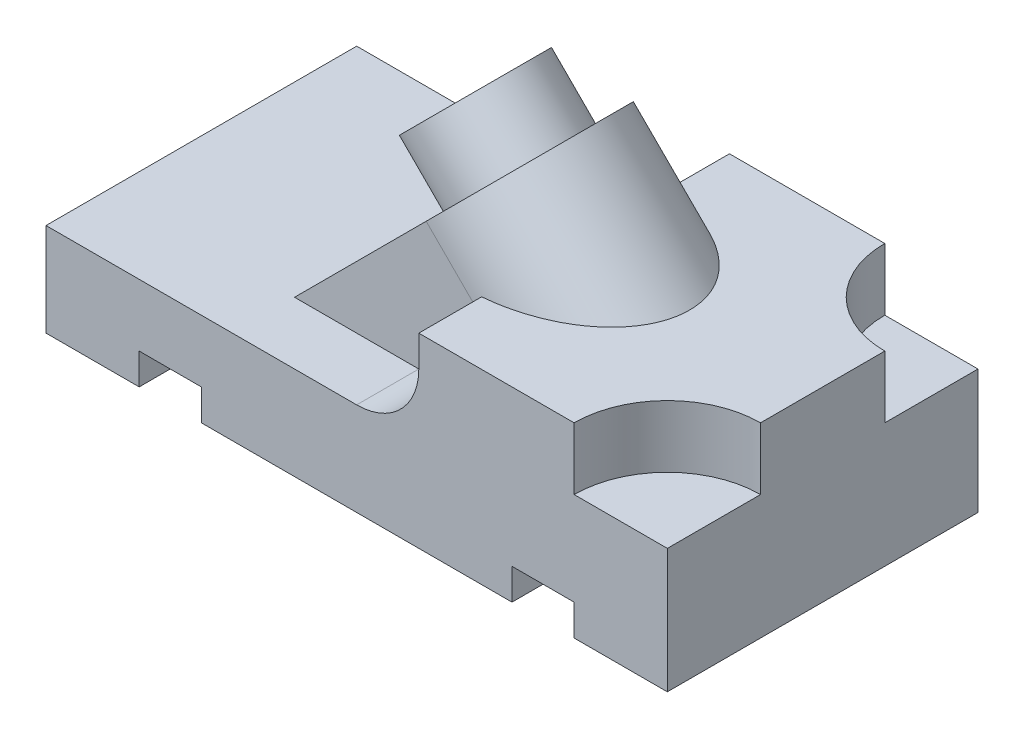
ISO-10303-21;
HEADER;
FILE_DESCRIPTION(('STEP AP214'),'2;1');
FILE_NAME('part.step','',(''),(''),'','','');
FILE_SCHEMA(('AUTOMOTIVE_DESIGN { 1 0 10303 214 1 1 1 1 }'));
ENDSEC;
DATA;
#1=APPLICATION_CONTEXT('core data for automotive mechanical design processes');
#2=APPLICATION_PROTOCOL_DEFINITION('international standard','automotive_design',2000,#1);
#3=PRODUCT_CONTEXT('',#1,'mechanical');
#4=PRODUCT('Part','Part','',(#3));
#5=PRODUCT_RELATED_PRODUCT_CATEGORY('part','',(#4));
#6=PRODUCT_DEFINITION_FORMATION('','',#4);
#7=PRODUCT_DEFINITION_CONTEXT('part definition',#1,'design');
#8=PRODUCT_DEFINITION('design','',#6,#7);
#9=PRODUCT_DEFINITION_SHAPE('','',#8);
#10=(LENGTH_UNIT() NAMED_UNIT(*) SI_UNIT(.MILLI.,.METRE.));
#11=(NAMED_UNIT(*) PLANE_ANGLE_UNIT() SI_UNIT($,.RADIAN.));
#12=(NAMED_UNIT(*) SI_UNIT($,.STERADIAN.) SOLID_ANGLE_UNIT());
#13=UNCERTAINTY_MEASURE_WITH_UNIT(LENGTH_MEASURE(1.E-05),#10,'distance_accuracy_value','');
#14=(GEOMETRIC_REPRESENTATION_CONTEXT(3) GLOBAL_UNCERTAINTY_ASSIGNED_CONTEXT((#13)) GLOBAL_UNIT_ASSIGNED_CONTEXT((#10,
#11,#12)) REPRESENTATION_CONTEXT('',''));
#15=CARTESIAN_POINT('',(0.,0.,0.));
#16=DIRECTION('',(0.,0.,1.));
#17=DIRECTION('',(1.,0.,0.));
#18=AXIS2_PLACEMENT_3D('',#15,#16,#17);
#19=CARTESIAN_POINT('',(100.,0.,50.));
#20=DIRECTION('',(0.,1.,0.));
#21=DIRECTION('',(0.,0.,1.));
#22=AXIS2_PLACEMENT_3D('',#19,#20,#21);
#23=PLANE('',#22);
#24=DIRECTION('',(0.,0.,1.));
#25=VECTOR('',#24,1.);
#26=CARTESIAN_POINT('',(25.,0.,0.));
#27=LINE('',#26,#25);
#28=CARTESIAN_POINT('',(25.,0.,0.));
#29=VERTEX_POINT('',#28);
#30=CARTESIAN_POINT('',(25.,0.,50.));
#31=VERTEX_POINT('',#30);
#32=EDGE_CURVE('E246',#29,#31,#27,.T.);
#33=ORIENTED_EDGE('',*,*,#32,.F.);
#34=DIRECTION('',(1.,0.,0.));
#35=VECTOR('',#34,1.);
#36=CARTESIAN_POINT('',(100.,0.,0.));
#37=LINE('',#36,#35);
#38=CARTESIAN_POINT('',(75.,0.,0.));
#39=VERTEX_POINT('',#38);
#40=EDGE_CURVE('E230',#29,#39,#37,.T.);
#41=ORIENTED_EDGE('',*,*,#40,.T.);
#42=DIRECTION('',(0.,0.,1.));
#43=VECTOR('',#42,1.);
#44=CARTESIAN_POINT('',(75.,0.,0.));
#45=LINE('',#44,#43);
#46=CARTESIAN_POINT('',(75.,0.,50.));
#47=VERTEX_POINT('',#46);
#48=EDGE_CURVE('E280',#39,#47,#45,.T.);
#49=ORIENTED_EDGE('',*,*,#48,.T.);
#50=DIRECTION('',(1.,0.,0.));
#51=VECTOR('',#50,1.);
#52=CARTESIAN_POINT('',(100.,0.,50.));
#53=LINE('',#52,#51);
#54=EDGE_CURVE('E383',#31,#47,#53,.T.);
#55=ORIENTED_EDGE('',*,*,#54,.F.);
#56=EDGE_LOOP('',(#33,#41,#49,#55));
#57=FACE_BOUND('',#56,.T.);
#58=ADVANCED_FACE('F41',(#57),#23,.F.);
#59=DIRECTION('',(0.,0.,1.));
#60=VECTOR('',#59,1.);
#61=CARTESIAN_POINT('',(15.,0.,0.));
#62=LINE('',#61,#60);
#63=CARTESIAN_POINT('',(15.,0.,0.));
#64=VERTEX_POINT('',#63);
#65=CARTESIAN_POINT('',(15.,0.,50.));
#66=VERTEX_POINT('',#65);
#67=EDGE_CURVE('E250',#64,#66,#62,.T.);
#68=ORIENTED_EDGE('',*,*,#67,.T.);
#69=CARTESIAN_POINT('',(0.,0.,50.));
#70=VERTEX_POINT('',#69);
#71=EDGE_CURVE('E378',#70,#66,#53,.T.);
#72=ORIENTED_EDGE('',*,*,#71,.F.);
#73=DIRECTION('',(0.,0.,-1.));
#74=VECTOR('',#73,1.);
#75=CARTESIAN_POINT('',(0.,0.,50.));
#76=LINE('',#75,#74);
#77=CARTESIAN_POINT('',(0.,0.,0.));
#78=VERTEX_POINT('',#77);
#79=EDGE_CURVE('E403',#70,#78,#76,.T.);
#80=ORIENTED_EDGE('',*,*,#79,.T.);
#81=EDGE_CURVE('E404',#78,#64,#37,.T.);
#82=ORIENTED_EDGE('',*,*,#81,.T.);
#83=EDGE_LOOP('',(#68,#72,#80,#82));
#84=FACE_BOUND('',#83,.T.);
#85=ADVANCED_FACE('F516',(#84),#23,.F.);
#86=DIRECTION('',(0.,0.,1.));
#87=VECTOR('',#86,1.);
#88=CARTESIAN_POINT('',(85.,0.,0.));
#89=LINE('',#88,#87);
#90=CARTESIAN_POINT('',(85.,0.,0.));
#91=VERTEX_POINT('',#90);
#92=CARTESIAN_POINT('',(85.,0.,50.));
#93=VERTEX_POINT('',#92);
#94=EDGE_CURVE('E243',#91,#93,#89,.T.);
#95=ORIENTED_EDGE('',*,*,#94,.F.);
#96=CARTESIAN_POINT('',(100.,0.,0.));
#97=VERTEX_POINT('',#96);
#98=EDGE_CURVE('E345',#91,#97,#37,.T.);
#99=ORIENTED_EDGE('',*,*,#98,.T.);
#100=DIRECTION('',(0.,0.,-1.));
#101=VECTOR('',#100,1.);
#102=CARTESIAN_POINT('',(100.,0.,50.));
#103=LINE('',#102,#101);
#104=CARTESIAN_POINT('',(100.,0.,50.));
#105=VERTEX_POINT('',#104);
#106=EDGE_CURVE('E455',#105,#97,#103,.T.);
#107=ORIENTED_EDGE('',*,*,#106,.F.);
#108=EDGE_CURVE('E384',#93,#105,#53,.T.);
#109=ORIENTED_EDGE('',*,*,#108,.F.);
#110=EDGE_LOOP('',(#95,#99,#107,#109));
#111=FACE_BOUND('',#110,.T.);
#112=ADVANCED_FACE('F547',(#111),#23,.F.);
#113=CARTESIAN_POINT('',(50.,25.,50.));
#114=DIRECTION('',(0.,0.,1.));
#115=DIRECTION('',(1.,0.,0.));
#116=AXIS2_PLACEMENT_3D('',#113,#114,#115);
#117=PLANE('',#116);
#118=DIRECTION('',(1.,0.,0.));
#119=VECTOR('',#118,1.);
#120=CARTESIAN_POINT('',(0.,5.,50.));
#121=LINE('',#120,#119);
#122=CARTESIAN_POINT('',(15.,5.,50.));
#123=VERTEX_POINT('',#122);
#124=CARTESIAN_POINT('',(25.,5.,50.));
#125=VERTEX_POINT('',#124);
#126=EDGE_CURVE('E236',#123,#125,#121,.T.);
#127=ORIENTED_EDGE('',*,*,#126,.T.);
#128=DIRECTION('',(0.,-1.,0.));
#129=VECTOR('',#128,1.);
#130=CARTESIAN_POINT('',(25.,0.,50.));
#131=LINE('',#130,#129);
#132=EDGE_CURVE('E222',#125,#31,#131,.T.);
#133=ORIENTED_EDGE('',*,*,#132,.T.);
#134=ORIENTED_EDGE('',*,*,#54,.T.);
#135=DIRECTION('',(0.,1.,0.));
#136=VECTOR('',#135,1.);
#137=CARTESIAN_POINT('',(75.,0.,50.));
#138=LINE('',#137,#136);
#139=CARTESIAN_POINT('',(75.,5.,50.));
#140=VERTEX_POINT('',#139);
#141=EDGE_CURVE('E260',#47,#140,#138,.T.);
#142=ORIENTED_EDGE('',*,*,#141,.T.);
#143=DIRECTION('',(1.,0.,0.));
#144=VECTOR('',#143,1.);
#145=CARTESIAN_POINT('',(0.,5.,50.));
#146=LINE('',#145,#144);
#147=CARTESIAN_POINT('',(85.,5.,50.));
#148=VERTEX_POINT('',#147);
#149=EDGE_CURVE('E271',#140,#148,#146,.T.);
#150=ORIENTED_EDGE('',*,*,#149,.T.);
#151=DIRECTION('',(0.,-1.,0.));
#152=VECTOR('',#151,1.);
#153=CARTESIAN_POINT('',(85.,0.,50.));
#154=LINE('',#153,#152);
#155=EDGE_CURVE('E267',#148,#93,#154,.T.);
#156=ORIENTED_EDGE('',*,*,#155,.T.);
#157=ORIENTED_EDGE('',*,*,#108,.T.);
#158=DIRECTION('',(0.,1.,0.));
#159=VECTOR('',#158,1.);
#160=CARTESIAN_POINT('',(100.,30.,50.));
#161=LINE('',#160,#159);
#162=CARTESIAN_POINT('',(100.,20.,50.));
#163=VERTEX_POINT('',#162);
#164=EDGE_CURVE('E382',#105,#163,#161,.T.);
#165=ORIENTED_EDGE('',*,*,#164,.T.);
#166=DIRECTION('',(-1.,0.,0.));
#167=VECTOR('',#166,1.);
#168=CARTESIAN_POINT('',(50.,20.,50.));
#169=LINE('',#168,#167);
#170=CARTESIAN_POINT('',(85.,20.,50.));
#171=VERTEX_POINT('',#170);
#172=EDGE_CURVE('E49',#163,#171,#169,.T.);
#173=ORIENTED_EDGE('',*,*,#172,.T.);
#174=DIRECTION('',(0.,1.,0.));
#175=VECTOR('',#174,1.);
#176=CARTESIAN_POINT('',(85.,20.,50.));
#177=LINE('',#176,#175);
#178=CARTESIAN_POINT('',(85.,30.,50.));
#179=VERTEX_POINT('',#178);
#180=EDGE_CURVE('E11',#179,#171,#177,.F.);
#181=ORIENTED_EDGE('',*,*,#180,.F.);
#182=DIRECTION('',(-1.,0.,0.));
#183=VECTOR('',#182,1.);
#184=CARTESIAN_POINT('',(60.,30.,50.));
#185=LINE('',#184,#183);
#186=CARTESIAN_POINT('',(60.,30.,50.));
#187=VERTEX_POINT('',#186);
#188=EDGE_CURVE('E388',#179,#187,#185,.T.);
#189=ORIENTED_EDGE('',*,*,#188,.T.);
#190=DIRECTION('',(0.,-1.,0.));
#191=VECTOR('',#190,1.);
#192=CARTESIAN_POINT('',(60.,25.0000000000001,50.));
#193=LINE('',#192,#191);
#194=CARTESIAN_POINT('',(60.,25.,50.));
#195=VERTEX_POINT('',#194);
#196=EDGE_CURVE('E391',#187,#195,#193,.T.);
#197=ORIENTED_EDGE('',*,*,#196,.T.);
#198=CARTESIAN_POINT('',(50.,25.,50.));
#199=DIRECTION('',(0.,0.,-1.));
#200=DIRECTION('',(1.,0.,0.));
#201=AXIS2_PLACEMENT_3D('',#198,#199,#200);
#202=CIRCLE('',#201,10.);
#203=CARTESIAN_POINT('',(50.,15.,50.));
#204=VERTEX_POINT('',#203);
#205=EDGE_CURVE('E394',#195,#204,#202,.T.);
#206=ORIENTED_EDGE('',*,*,#205,.T.);
#207=DIRECTION('',(-1.,0.,0.));
#208=VECTOR('',#207,1.);
#209=CARTESIAN_POINT('',(0.,15.,50.));
#210=LINE('',#209,#208);
#211=CARTESIAN_POINT('',(0.,15.,50.));
#212=VERTEX_POINT('',#211);
#213=EDGE_CURVE('E397',#204,#212,#210,.T.);
#214=ORIENTED_EDGE('',*,*,#213,.T.);
#215=DIRECTION('',(0.,-1.,0.));
#216=VECTOR('',#215,1.);
#217=CARTESIAN_POINT('',(0.,0.,50.));
#218=LINE('',#217,#216);
#219=EDGE_CURVE('E400',#212,#70,#218,.T.);
#220=ORIENTED_EDGE('',*,*,#219,.T.);
#221=ORIENTED_EDGE('',*,*,#71,.T.);
#222=DIRECTION('',(0.,1.,0.));
#223=VECTOR('',#222,1.);
#224=CARTESIAN_POINT('',(15.,0.,50.));
#225=LINE('',#224,#223);
#226=EDGE_CURVE('E232',#66,#123,#225,.T.);
#227=ORIENTED_EDGE('',*,*,#226,.T.);
#228=EDGE_LOOP('',(#127,#133,#134,#142,#150,#156,#157,#165,#173,#181,#189,#197,#206,#214,#220,
#221,#227));
#229=FACE_BOUND('',#228,.T.);
#230=ADVANCED_FACE('F473',(#229),#117,.T.);
#231=CARTESIAN_POINT('',(50.,25.,0.));
#232=DIRECTION('',(0.,0.,1.));
#233=DIRECTION('',(1.,0.,0.));
#234=AXIS2_PLACEMENT_3D('',#231,#232,#233);
#235=PLANE('',#234);
#236=DIRECTION('',(0.,-1.,0.));
#237=VECTOR('',#236,1.);
#238=CARTESIAN_POINT('',(25.,0.,0.));
#239=LINE('',#238,#237);
#240=CARTESIAN_POINT('',(25.,5.,0.));
#241=VERTEX_POINT('',#240);
#242=EDGE_CURVE('E216',#241,#29,#239,.T.);
#243=ORIENTED_EDGE('',*,*,#242,.F.);
#244=DIRECTION('',(1.,0.,0.));
#245=VECTOR('',#244,1.);
#246=CARTESIAN_POINT('',(0.,5.,0.));
#247=LINE('',#246,#245);
#248=CARTESIAN_POINT('',(15.,5.,0.));
#249=VERTEX_POINT('',#248);
#250=EDGE_CURVE('E206',#249,#241,#247,.T.);
#251=ORIENTED_EDGE('',*,*,#250,.F.);
#252=DIRECTION('',(0.,1.,0.));
#253=VECTOR('',#252,1.);
#254=CARTESIAN_POINT('',(15.,0.,0.));
#255=LINE('',#254,#253);
#256=EDGE_CURVE('E215',#64,#249,#255,.T.);
#257=ORIENTED_EDGE('',*,*,#256,.F.);
#258=ORIENTED_EDGE('',*,*,#81,.F.);
#259=DIRECTION('',(0.,-1.,0.));
#260=VECTOR('',#259,1.);
#261=CARTESIAN_POINT('',(0.,0.,0.));
#262=LINE('',#261,#260);
#263=CARTESIAN_POINT('',(0.,15.,0.));
#264=VERTEX_POINT('',#263);
#265=EDGE_CURVE('E426',#264,#78,#262,.T.);
#266=ORIENTED_EDGE('',*,*,#265,.F.);
#267=DIRECTION('',(-1.,0.,0.));
#268=VECTOR('',#267,1.);
#269=CARTESIAN_POINT('',(0.,15.,0.));
#270=LINE('',#269,#268);
#271=CARTESIAN_POINT('',(50.,15.,0.));
#272=VERTEX_POINT('',#271);
#273=EDGE_CURVE('E423',#272,#264,#270,.T.);
#274=ORIENTED_EDGE('',*,*,#273,.F.);
#275=CARTESIAN_POINT('',(50.,25.,0.));
#276=DIRECTION('',(0.,0.,-1.));
#277=DIRECTION('',(1.,0.,0.));
#278=AXIS2_PLACEMENT_3D('',#275,#276,#277);
#279=CIRCLE('',#278,10.);
#280=CARTESIAN_POINT('',(60.,25.,0.));
#281=VERTEX_POINT('',#280);
#282=EDGE_CURVE('E419',#281,#272,#279,.T.);
#283=ORIENTED_EDGE('',*,*,#282,.F.);
#284=DIRECTION('',(0.,-1.,0.));
#285=VECTOR('',#284,1.);
#286=CARTESIAN_POINT('',(60.,25.0000000000001,0.));
#287=LINE('',#286,#285);
#288=CARTESIAN_POINT('',(60.,30.,0.));
#289=VERTEX_POINT('',#288);
#290=EDGE_CURVE('E415',#289,#281,#287,.T.);
#291=ORIENTED_EDGE('',*,*,#290,.F.);
#292=DIRECTION('',(-1.,0.,0.));
#293=VECTOR('',#292,1.);
#294=CARTESIAN_POINT('',(60.,30.,0.));
#295=LINE('',#294,#293);
#296=CARTESIAN_POINT('',(85.,30.,0.));
#297=VERTEX_POINT('',#296);
#298=EDGE_CURVE('E412',#297,#289,#295,.T.);
#299=ORIENTED_EDGE('',*,*,#298,.F.);
#300=DIRECTION('',(0.,1.,0.));
#301=VECTOR('',#300,1.);
#302=CARTESIAN_POINT('',(85.,20.,0.));
#303=LINE('',#302,#301);
#304=CARTESIAN_POINT('',(85.,20.,0.));
#305=VERTEX_POINT('',#304);
#306=EDGE_CURVE('E466',#297,#305,#303,.F.);
#307=ORIENTED_EDGE('',*,*,#306,.T.);
#308=DIRECTION('',(-1.,0.,0.));
#309=VECTOR('',#308,1.);
#310=CARTESIAN_POINT('',(50.,20.,0.));
#311=LINE('',#310,#309);
#312=CARTESIAN_POINT('',(100.,20.,0.));
#313=VERTEX_POINT('',#312);
#314=EDGE_CURVE('E463',#313,#305,#311,.T.);
#315=ORIENTED_EDGE('',*,*,#314,.F.);
#316=DIRECTION('',(0.,1.,0.));
#317=VECTOR('',#316,1.);
#318=CARTESIAN_POINT('',(100.,30.,0.));
#319=LINE('',#318,#317);
#320=EDGE_CURVE('E408',#97,#313,#319,.T.);
#321=ORIENTED_EDGE('',*,*,#320,.F.);
#322=ORIENTED_EDGE('',*,*,#98,.F.);
#323=DIRECTION('',(0.,-1.,0.));
#324=VECTOR('',#323,1.);
#325=CARTESIAN_POINT('',(85.,0.,0.));
#326=LINE('',#325,#324);
#327=CARTESIAN_POINT('',(85.,5.,0.));
#328=VERTEX_POINT('',#327);
#329=EDGE_CURVE('E256',#328,#91,#326,.T.);
#330=ORIENTED_EDGE('',*,*,#329,.F.);
#331=DIRECTION('',(1.,0.,0.));
#332=VECTOR('',#331,1.);
#333=CARTESIAN_POINT('',(0.,5.,0.));
#334=LINE('',#333,#332);
#335=CARTESIAN_POINT('',(75.,5.,0.));
#336=VERTEX_POINT('',#335);
#337=EDGE_CURVE('E259',#336,#328,#334,.T.);
#338=ORIENTED_EDGE('',*,*,#337,.F.);
#339=DIRECTION('',(0.,1.,0.));
#340=VECTOR('',#339,1.);
#341=CARTESIAN_POINT('',(75.,0.,0.));
#342=LINE('',#341,#340);
#343=EDGE_CURVE('E263',#39,#336,#342,.T.);
#344=ORIENTED_EDGE('',*,*,#343,.F.);
#345=ORIENTED_EDGE('',*,*,#40,.F.);
#346=EDGE_LOOP('',(#243,#251,#257,#258,#266,#274,#283,#291,#299,#307,#315,#321,#322,#330,#338,
#344,#345));
#347=FACE_BOUND('',#346,.T.);
#348=ADVANCED_FACE('F227',(#347),#235,.F.);
#349=CARTESIAN_POINT('',(60.,25.0000000000001,50.));
#350=DIRECTION('',(1.,0.,0.));
#351=DIRECTION('',(0.,0.,-1.));
#352=AXIS2_PLACEMENT_3D('',#349,#350,#351);
#353=PLANE('',#352);
#354=CARTESIAN_POINT('',(60.,27.3745695394363,25.));
#355=DIRECTION('',(1.,0.,0.));
#356=DIRECTION('',(0.,1.,0.));
#357=AXIS2_PLACEMENT_3D('',#354,#355,#356);
#358=ELLIPSE('',#357,21.2132034355964,15.);
#359=CARTESIAN_POINT('',(60.,30.,39.8846752550525));
#360=VERTEX_POINT('',#359);
#361=CARTESIAN_POINT('',(60.,27.3745695394363,40.));
#362=VERTEX_POINT('',#361);
#363=EDGE_CURVE('E337',#360,#362,#358,.T.);
#364=ORIENTED_EDGE('',*,*,#363,.T.);
#365=DIRECTION('',(0.,1.,0.));
#366=VECTOR('',#365,1.);
#367=CARTESIAN_POINT('',(60.,-50.0014142135624,40.));
#368=LINE('',#367,#366);
#369=CARTESIAN_POINT('',(60.,25.,40.));
#370=VERTEX_POINT('',#369);
#371=EDGE_CURVE('E330',#370,#362,#368,.T.);
#372=ORIENTED_EDGE('',*,*,#371,.F.);
#373=DIRECTION('',(0.,0.,-1.));
#374=VECTOR('',#373,1.);
#375=CARTESIAN_POINT('',(60.,25.,50.));
#376=LINE('',#375,#374);
#377=EDGE_CURVE('E442',#195,#370,#376,.T.);
#378=ORIENTED_EDGE('',*,*,#377,.F.);
#379=ORIENTED_EDGE('',*,*,#196,.F.);
#380=DIRECTION('',(0.,0.,-1.));
#381=VECTOR('',#380,1.);
#382=CARTESIAN_POINT('',(60.,30.,50.));
#383=LINE('',#382,#381);
#384=EDGE_CURVE('E447',#187,#360,#383,.T.);
#385=ORIENTED_EDGE('',*,*,#384,.T.);
#386=EDGE_LOOP('',(#364,#372,#378,#379,#385));
#387=FACE_BOUND('',#386,.T.);
#388=ADVANCED_FACE('F499',(#387),#353,.F.);
#389=CARTESIAN_POINT('',(60.,27.3745695394363,10.));
#390=VERTEX_POINT('',#389);
#391=CARTESIAN_POINT('',(60.,30.,10.1153247449475));
#392=VERTEX_POINT('',#391);
#393=EDGE_CURVE('E359',#390,#392,#358,.T.);
#394=ORIENTED_EDGE('',*,*,#393,.T.);
#395=EDGE_CURVE('E446',#392,#289,#383,.T.);
#396=ORIENTED_EDGE('',*,*,#395,.T.);
#397=ORIENTED_EDGE('',*,*,#290,.T.);
#398=CARTESIAN_POINT('',(60.,25.,10.));
#399=VERTEX_POINT('',#398);
#400=EDGE_CURVE('E441',#399,#281,#376,.T.);
#401=ORIENTED_EDGE('',*,*,#400,.F.);
#402=DIRECTION('',(0.,1.,0.));
#403=VECTOR('',#402,1.);
#404=CARTESIAN_POINT('',(60.,-50.0014142135624,10.));
#405=LINE('',#404,#403);
#406=EDGE_CURVE('E323',#399,#390,#405,.T.);
#407=ORIENTED_EDGE('',*,*,#406,.T.);
#408=EDGE_LOOP('',(#394,#396,#397,#401,#407));
#409=FACE_BOUND('',#408,.T.);
#410=ADVANCED_FACE('F532',(#409),#353,.F.);
#411=CARTESIAN_POINT('',(50.,25.,50.));
#412=DIRECTION('',(0.,0.,-1.));
#413=DIRECTION('',(-1.,0.,0.));
#414=AXIS2_PLACEMENT_3D('',#411,#412,#413);
#415=CYLINDRICAL_SURFACE('',#414,10.);
#416=CARTESIAN_POINT('',(50.,25.,10.));
#417=DIRECTION('',(0.,0.,1.));
#418=DIRECTION('',(1.,0.,0.));
#419=AXIS2_PLACEMENT_3D('',#416,#417,#418);
#420=CIRCLE('',#419,10.);
#421=CARTESIAN_POINT('',(50.,15.,10.));
#422=VERTEX_POINT('',#421);
#423=EDGE_CURVE('E371',#422,#399,#420,.T.);
#424=ORIENTED_EDGE('',*,*,#423,.T.);
#425=ORIENTED_EDGE('',*,*,#400,.T.);
#426=ORIENTED_EDGE('',*,*,#282,.T.);
#427=DIRECTION('',(0.,0.,-1.));
#428=VECTOR('',#427,1.);
#429=CARTESIAN_POINT('',(50.,15.,50.));
#430=LINE('',#429,#428);
#431=EDGE_CURVE('E436',#422,#272,#430,.T.);
#432=ORIENTED_EDGE('',*,*,#431,.F.);
#433=EDGE_LOOP('',(#424,#425,#426,#432));
#434=FACE_BOUND('',#433,.T.);
#435=ADVANCED_FACE('F527',(#434),#415,.F.);
#436=CARTESIAN_POINT('',(100.,30.,50.));
#437=DIRECTION('',(-1.,0.,0.));
#438=DIRECTION('',(0.,0.,1.));
#439=AXIS2_PLACEMENT_3D('',#436,#437,#438);
#440=PLANE('',#439);
#441=DIRECTION('',(0.,0.,-1.));
#442=VECTOR('',#441,1.);
#443=CARTESIAN_POINT('',(100.,20.,50.));
#444=LINE('',#443,#442);
#445=CARTESIAN_POINT('',(100.,20.,15.));
#446=VERTEX_POINT('',#445);
#447=EDGE_CURVE('E292',#446,#313,#444,.T.);
#448=ORIENTED_EDGE('',*,*,#447,.F.);
#449=DIRECTION('',(0.,1.,0.));
#450=VECTOR('',#449,1.);
#451=CARTESIAN_POINT('',(100.,20.,15.));
#452=LINE('',#451,#450);
#453=CARTESIAN_POINT('',(100.,30.,15.));
#454=VERTEX_POINT('',#453);
#455=EDGE_CURVE('E303',#446,#454,#452,.T.);
#456=ORIENTED_EDGE('',*,*,#455,.T.);
#457=DIRECTION('',(0.,0.,-1.));
#458=VECTOR('',#457,1.);
#459=CARTESIAN_POINT('',(100.,30.,50.));
#460=LINE('',#459,#458);
#461=CARTESIAN_POINT('',(100.,30.,35.));
#462=VERTEX_POINT('',#461);
#463=EDGE_CURVE('E451',#462,#454,#460,.T.);
#464=ORIENTED_EDGE('',*,*,#463,.F.);
#465=DIRECTION('',(0.,1.,0.));
#466=VECTOR('',#465,1.);
#467=CARTESIAN_POINT('',(100.,20.,35.));
#468=LINE('',#467,#466);
#469=CARTESIAN_POINT('',(100.,20.,35.));
#470=VERTEX_POINT('',#469);
#471=EDGE_CURVE('E310',#462,#470,#468,.F.);
#472=ORIENTED_EDGE('',*,*,#471,.T.);
#473=DIRECTION('',(0.,0.,-1.));
#474=VECTOR('',#473,1.);
#475=CARTESIAN_POINT('',(100.,20.,50.));
#476=LINE('',#475,#474);
#477=EDGE_CURVE('E307',#163,#470,#476,.T.);
#478=ORIENTED_EDGE('',*,*,#477,.F.);
#479=ORIENTED_EDGE('',*,*,#164,.F.);
#480=ORIENTED_EDGE('',*,*,#106,.T.);
#481=ORIENTED_EDGE('',*,*,#320,.T.);
#482=EDGE_LOOP('',(#448,#456,#464,#472,#478,#479,#480,#481));
#483=FACE_BOUND('',#482,.T.);
#484=ADVANCED_FACE('F482',(#483),#440,.F.);
#485=CARTESIAN_POINT('',(60.,30.,50.));
#486=DIRECTION('',(0.,-1.,0.));
#487=DIRECTION('',(0.,0.,-1.));
#488=AXIS2_PLACEMENT_3D('',#485,#486,#487);
#489=PLANE('',#488);
#490=ORIENTED_EDGE('',*,*,#463,.T.);
#491=CARTESIAN_POINT('',(100.,30.,0.));
#492=DIRECTION('',(0.,1.,0.));
#493=DIRECTION('',(0.,0.,1.));
#494=AXIS2_PLACEMENT_3D('',#491,#492,#493);
#495=CIRCLE('',#494,15.);
#496=EDGE_CURVE('E293',#297,#454,#495,.T.);
#497=ORIENTED_EDGE('',*,*,#496,.F.);
#498=ORIENTED_EDGE('',*,*,#298,.T.);
#499=ORIENTED_EDGE('',*,*,#395,.F.);
#500=CARTESIAN_POINT('',(57.3745695394363,30.,25.));
#501=DIRECTION('',(0.,-1.,0.));
#502=DIRECTION('',(-1.,0.,0.));
#503=AXIS2_PLACEMENT_3D('',#500,#501,#502);
#504=ELLIPSE('',#503,21.2132034355965,15.);
#505=EDGE_CURVE('E363',#392,#360,#504,.T.);
#506=ORIENTED_EDGE('',*,*,#505,.T.);
#507=ORIENTED_EDGE('',*,*,#384,.F.);
#508=ORIENTED_EDGE('',*,*,#188,.F.);
#509=CARTESIAN_POINT('',(100.,30.,50.));
#510=DIRECTION('',(0.,1.,0.));
#511=DIRECTION('',(0.,0.,1.));
#512=AXIS2_PLACEMENT_3D('',#509,#510,#511);
#513=CIRCLE('',#512,15.);
#514=EDGE_CURVE('E249',#462,#179,#513,.T.);
#515=ORIENTED_EDGE('',*,*,#514,.F.);
#516=EDGE_LOOP('',(#490,#497,#498,#499,#506,#507,#508,#515));
#517=FACE_BOUND('',#516,.T.);
#518=ADVANCED_FACE('F489',(#517),#489,.F.);
#519=ORIENTED_EDGE('',*,*,#377,.T.);
#520=CARTESIAN_POINT('',(50.,25.,40.));
#521=DIRECTION('',(0.,0.,1.));
#522=DIRECTION('',(0.,-1.,0.));
#523=AXIS2_PLACEMENT_3D('',#520,#521,#522);
#524=CIRCLE('',#523,10.);
#525=CARTESIAN_POINT('',(50.,15.,40.));
#526=VERTEX_POINT('',#525);
#527=EDGE_CURVE('E327',#526,#370,#524,.T.);
#528=ORIENTED_EDGE('',*,*,#527,.F.);
#529=EDGE_CURVE('E437',#204,#526,#430,.T.);
#530=ORIENTED_EDGE('',*,*,#529,.F.);
#531=ORIENTED_EDGE('',*,*,#205,.F.);
#532=EDGE_LOOP('',(#519,#528,#530,#531));
#533=FACE_BOUND('',#532,.T.);
#534=ADVANCED_FACE('F502',(#533),#415,.F.);
#535=CARTESIAN_POINT('',(0.,15.,50.));
#536=DIRECTION('',(0.,-1.,0.));
#537=DIRECTION('',(0.,0.,-1.));
#538=AXIS2_PLACEMENT_3D('',#535,#536,#537);
#539=PLANE('',#538);
#540=ORIENTED_EDGE('',*,*,#529,.T.);
#541=DIRECTION('',(1.,0.,0.));
#542=VECTOR('',#541,1.);
#543=CARTESIAN_POINT('',(50.0014142135625,15.,40.));
#544=LINE('',#543,#542);
#545=CARTESIAN_POINT('',(30.,15.,40.));
#546=VERTEX_POINT('',#545);
#547=EDGE_CURVE('E331',#546,#526,#544,.T.);
#548=ORIENTED_EDGE('',*,*,#547,.F.);
#549=DIRECTION('',(0.,0.,1.));
#550=VECTOR('',#549,1.);
#551=CARTESIAN_POINT('',(30.,15.,0.));
#552=LINE('',#551,#550);
#553=CARTESIAN_POINT('',(30.,15.,10.));
#554=VERTEX_POINT('',#553);
#555=EDGE_CURVE('E334',#554,#546,#552,.T.);
#556=ORIENTED_EDGE('',*,*,#555,.F.);
#557=DIRECTION('',(1.,0.,0.));
#558=VECTOR('',#557,1.);
#559=CARTESIAN_POINT('',(50.0014142135625,15.,10.));
#560=LINE('',#559,#558);
#561=EDGE_CURVE('E367',#554,#422,#560,.T.);
#562=ORIENTED_EDGE('',*,*,#561,.T.);
#563=ORIENTED_EDGE('',*,*,#431,.T.);
#564=ORIENTED_EDGE('',*,*,#273,.T.);
#565=DIRECTION('',(0.,0.,-1.));
#566=VECTOR('',#565,1.);
#567=CARTESIAN_POINT('',(0.,15.,50.));
#568=LINE('',#567,#566);
#569=EDGE_CURVE('E432',#212,#264,#568,.T.);
#570=ORIENTED_EDGE('',*,*,#569,.F.);
#571=ORIENTED_EDGE('',*,*,#213,.F.);
#572=EDGE_LOOP('',(#540,#548,#556,#562,#563,#564,#570,#571));
#573=FACE_BOUND('',#572,.T.);
#574=ADVANCED_FACE('F507',(#573),#539,.F.);
#575=CARTESIAN_POINT('',(0.,0.,50.));
#576=DIRECTION('',(1.,0.,0.));
#577=DIRECTION('',(0.,0.,-1.));
#578=AXIS2_PLACEMENT_3D('',#575,#576,#577);
#579=PLANE('',#578);
#580=ORIENTED_EDGE('',*,*,#265,.T.);
#581=ORIENTED_EDGE('',*,*,#79,.F.);
#582=ORIENTED_EDGE('',*,*,#219,.F.);
#583=ORIENTED_EDGE('',*,*,#569,.T.);
#584=EDGE_LOOP('',(#580,#581,#582,#583));
#585=FACE_BOUND('',#584,.T.);
#586=ADVANCED_FACE('F512',(#585),#579,.F.);
#587=CARTESIAN_POINT('',(93.6886989832806,-6.31412944384418,25.));
#588=DIRECTION('',(-0.707106781186549,0.707106781186546,0.));
#589=DIRECTION('',(-0.707106781186546,-0.707106781186549,0.));
#590=AXIS2_PLACEMENT_3D('',#587,#588,#589);
#591=CYLINDRICAL_SURFACE('',#590,15.);
#592=ORIENTED_EDGE('',*,*,#363,.F.);
#593=ORIENTED_EDGE('',*,*,#505,.F.);
#594=ORIENTED_EDGE('',*,*,#393,.F.);
#595=DIRECTION('',(-0.707106781186549,0.707106781186546,0.));
#596=VECTOR('',#595,1.);
#597=CARTESIAN_POINT('',(93.6886989832806,-6.31412944384418,10.));
#598=LINE('',#597,#596);
#599=CARTESIAN_POINT('',(51.1872847697181,36.1872847697182,10.));
#600=VERTEX_POINT('',#599);
#601=EDGE_CURVE('E349',#390,#600,#598,.T.);
#602=ORIENTED_EDGE('',*,*,#601,.T.);
#603=CARTESIAN_POINT('',(51.1872847697181,36.1872847697182,25.));
#604=DIRECTION('',(-0.707106781186549,0.707106781186546,0.));
#605=DIRECTION('',(-0.707106781186546,-0.707106781186549,0.));
#606=AXIS2_PLACEMENT_3D('',#603,#604,#605);
#607=CIRCLE('',#606,15.);
#608=CARTESIAN_POINT('',(51.1872847697181,36.1872847697182,40.));
#609=VERTEX_POINT('',#608);
#610=EDGE_CURVE('E341',#600,#609,#607,.F.);
#611=ORIENTED_EDGE('',*,*,#610,.T.);
#612=DIRECTION('',(-0.707106781186549,0.707106781186546,0.));
#613=VECTOR('',#612,1.);
#614=CARTESIAN_POINT('',(93.6886989832806,-6.31412944384418,40.));
#615=LINE('',#614,#613);
#616=EDGE_CURVE('E340',#362,#609,#615,.T.);
#617=ORIENTED_EDGE('',*,*,#616,.F.);
#618=EDGE_LOOP('',(#592,#593,#594,#602,#611,#617));
#619=FACE_BOUND('',#618,.T.);
#620=ADVANCED_FACE('F591',(#619),#591,.T.);
#621=CARTESIAN_POINT('',(50.0014142135625,-50.0014142135624,40.));
#622=DIRECTION('',(0.,0.,1.));
#623=DIRECTION('',(0.,-1.,0.));
#624=AXIS2_PLACEMENT_3D('',#621,#622,#623);
#625=PLANE('',#624);
#626=DIRECTION('',(0.707106781186546,0.707106781186549,0.));
#627=VECTOR('',#626,1.);
#628=CARTESIAN_POINT('',(7.50000000000005,-7.50000000000004,40.));
#629=LINE('',#628,#627);
#630=EDGE_CURVE('E346',#546,#609,#629,.T.);
#631=ORIENTED_EDGE('',*,*,#630,.F.);
#632=ORIENTED_EDGE('',*,*,#547,.T.);
#633=ORIENTED_EDGE('',*,*,#527,.T.);
#634=ORIENTED_EDGE('',*,*,#371,.T.);
#635=ORIENTED_EDGE('',*,*,#616,.T.);
#636=EDGE_LOOP('',(#631,#632,#633,#634,#635));
#637=FACE_BOUND('',#636,.T.);
#638=ADVANCED_FACE('F730',(#637),#625,.T.);
#639=CARTESIAN_POINT('',(50.0014142135625,-50.0014142135624,10.));
#640=DIRECTION('',(0.,0.,1.));
#641=DIRECTION('',(1.,0.,0.));
#642=AXIS2_PLACEMENT_3D('',#639,#640,#641);
#643=PLANE('',#642);
#644=ORIENTED_EDGE('',*,*,#561,.F.);
#645=DIRECTION('',(0.707106781186546,0.707106781186549,0.));
#646=VECTOR('',#645,1.);
#647=CARTESIAN_POINT('',(7.50000000000006,-7.50000000000003,10.));
#648=LINE('',#647,#646);
#649=EDGE_CURVE('E352',#554,#600,#648,.T.);
#650=ORIENTED_EDGE('',*,*,#649,.T.);
#651=ORIENTED_EDGE('',*,*,#601,.F.);
#652=ORIENTED_EDGE('',*,*,#406,.F.);
#653=ORIENTED_EDGE('',*,*,#423,.F.);
#654=EDGE_LOOP('',(#644,#650,#651,#652,#653));
#655=FACE_BOUND('',#654,.T.);
#656=ADVANCED_FACE('F723',(#655),#643,.F.);
#657=CARTESIAN_POINT('',(7.50000000000006,-7.50000000000003,0.));
#658=DIRECTION('',(-0.707106781186549,0.707106781186546,0.));
#659=DIRECTION('',(-0.707106781186546,-0.707106781186549,0.));
#660=AXIS2_PLACEMENT_3D('',#657,#658,#659);
#661=PLANE('',#660);
#662=CARTESIAN_POINT('',(51.1872847697181,36.1872847697182,25.));
#663=DIRECTION('',(-0.707106781186549,0.707106781186546,0.));
#664=DIRECTION('',(-0.707106781186546,-0.707106781186549,0.));
#665=AXIS2_PLACEMENT_3D('',#662,#663,#664);
#666=CIRCLE('',#665,9.99999999999999);
#667=CARTESIAN_POINT('',(44.1162169578527,29.1162169578527,25.));
#668=VERTEX_POINT('',#667);
#669=EDGE_CURVE('E318',#668,#668,#666,.T.);
#670=ORIENTED_EDGE('',*,*,#669,.F.);
#671=EDGE_LOOP('',(#670));
#672=FACE_BOUND('',#671,.T.);
#673=ORIENTED_EDGE('',*,*,#649,.F.);
#674=ORIENTED_EDGE('',*,*,#555,.T.);
#675=ORIENTED_EDGE('',*,*,#630,.T.);
#676=ORIENTED_EDGE('',*,*,#610,.F.);
#677=EDGE_LOOP('',(#673,#674,#675,#676));
#678=FACE_BOUND('',#677,.T.);
#679=ADVANCED_FACE('F586',(#672,#678),#661,.T.);
#680=CARTESIAN_POINT('',(44.1162169578526,43.2583525815836,25.));
#681=DIRECTION('',(-0.707106781186549,0.707106781186546,0.));
#682=DIRECTION('',(-0.707106781186546,-0.707106781186549,0.));
#683=AXIS2_PLACEMENT_3D('',#680,#681,#682);
#684=PLANE('',#683);
#685=CARTESIAN_POINT('',(44.1162169578526,43.2583525815836,25.));
#686=DIRECTION('',(-0.707106781186549,0.707106781186546,0.));
#687=DIRECTION('',(-0.707106781186546,-0.707106781186549,0.));
#688=AXIS2_PLACEMENT_3D('',#685,#686,#687);
#689=CIRCLE('',#688,9.99999999999999);
#690=CARTESIAN_POINT('',(37.0451491459872,36.1872847697181,25.));
#691=VERTEX_POINT('',#690);
#692=EDGE_CURVE('E319',#691,#691,#689,.T.);
#693=ORIENTED_EDGE('',*,*,#692,.T.);
#694=EDGE_LOOP('',(#693));
#695=FACE_BOUND('',#694,.T.);
#696=CARTESIAN_POINT('',(44.1162169578526,43.2583525815836,25.));
#697=DIRECTION('',(-0.707106781186549,0.707106781186546,0.));
#698=DIRECTION('',(-0.707106781186546,-0.707106781186549,0.));
#699=AXIS2_PLACEMENT_3D('',#696,#697,#698);
#700=CIRCLE('',#699,5.);
#701=CARTESIAN_POINT('',(40.5806830519199,39.7228186756509,25.));
#702=VERTEX_POINT('',#701);
#703=EDGE_CURVE('E314',#702,#702,#700,.T.);
#704=ORIENTED_EDGE('',*,*,#703,.F.);
#705=EDGE_LOOP('',(#704));
#706=FACE_BOUND('',#705,.T.);
#707=ADVANCED_FACE('F708',(#695,#706),#684,.T.);
#708=CARTESIAN_POINT('',(44.1162169578526,43.2583525815836,25.));
#709=DIRECTION('',(0.707106781186549,-0.707106781186546,0.));
#710=DIRECTION('',(0.707106781186546,0.707106781186549,0.));
#711=AXIS2_PLACEMENT_3D('',#708,#709,#710);
#712=CYLINDRICAL_SURFACE('',#711,9.99999999999999);
#713=ORIENTED_EDGE('',*,*,#692,.F.);
#714=EDGE_LOOP('',(#713));
#715=FACE_BOUND('',#714,.T.);
#716=ORIENTED_EDGE('',*,*,#669,.T.);
#717=EDGE_LOOP('',(#716));
#718=FACE_BOUND('',#717,.T.);
#719=ADVANCED_FACE('F700',(#715,#718),#712,.T.);
#720=CARTESIAN_POINT('',(44.1162169578526,43.2583525815836,25.));
#721=DIRECTION('',(0.707106781186549,-0.707106781186546,0.));
#722=DIRECTION('',(0.707106781186546,0.707106781186549,0.));
#723=AXIS2_PLACEMENT_3D('',#720,#721,#722);
#724=CYLINDRICAL_SURFACE('',#723,5.);
#725=ORIENTED_EDGE('',*,*,#703,.T.);
#726=EDGE_LOOP('',(#725));
#727=FACE_BOUND('',#726,.T.);
#728=CARTESIAN_POINT('',(51.1872847697181,36.1872847697182,25.));
#729=DIRECTION('',(-0.707106781186549,0.707106781186546,0.));
#730=DIRECTION('',(-0.707106781186546,-0.707106781186549,0.));
#731=AXIS2_PLACEMENT_3D('',#728,#729,#730);
#732=CIRCLE('',#731,5.);
#733=CARTESIAN_POINT('',(47.6517508637854,32.6517508637854,25.));
#734=VERTEX_POINT('',#733);
#735=EDGE_CURVE('E459',#734,#734,#732,.F.);
#736=ORIENTED_EDGE('',*,*,#735,.T.);
#737=EDGE_LOOP('',(#736));
#738=FACE_BOUND('',#737,.T.);
#739=ADVANCED_FACE('F693',(#727,#738),#724,.F.);
#740=ORIENTED_EDGE('',*,*,#735,.F.);
#741=EDGE_LOOP('',(#740));
#742=FACE_BOUND('',#741,.T.);
#743=ADVANCED_FACE('F685',(#742),#661,.T.);
#744=CARTESIAN_POINT('',(100.,20.,0.));
#745=DIRECTION('',(0.,1.,0.));
#746=DIRECTION('',(0.,0.,1.));
#747=AXIS2_PLACEMENT_3D('',#744,#745,#746);
#748=CYLINDRICAL_SURFACE('',#747,15.);
#749=CARTESIAN_POINT('',(100.,20.,0.));
#750=DIRECTION('',(0.,1.,0.));
#751=DIRECTION('',(0.,0.,1.));
#752=AXIS2_PLACEMENT_3D('',#749,#750,#751);
#753=CIRCLE('',#752,15.);
#754=EDGE_CURVE('E288',#305,#446,#753,.T.);
#755=ORIENTED_EDGE('',*,*,#754,.F.);
#756=ORIENTED_EDGE('',*,*,#306,.F.);
#757=ORIENTED_EDGE('',*,*,#496,.T.);
#758=ORIENTED_EDGE('',*,*,#455,.F.);
#759=EDGE_LOOP('',(#755,#756,#757,#758));
#760=FACE_BOUND('',#759,.T.);
#761=ADVANCED_FACE('F538',(#760),#748,.F.);
#762=CARTESIAN_POINT('',(100.,20.,0.));
#763=DIRECTION('',(0.,1.,0.));
#764=DIRECTION('',(0.,0.,1.));
#765=AXIS2_PLACEMENT_3D('',#762,#763,#764);
#766=PLANE('',#765);
#767=ORIENTED_EDGE('',*,*,#447,.T.);
#768=ORIENTED_EDGE('',*,*,#314,.T.);
#769=ORIENTED_EDGE('',*,*,#754,.T.);
#770=EDGE_LOOP('',(#767,#768,#769));
#771=FACE_BOUND('',#770,.T.);
#772=ADVANCED_FACE('F541',(#771),#766,.T.);
#773=CARTESIAN_POINT('',(100.,20.,50.));
#774=DIRECTION('',(0.,1.,0.));
#775=DIRECTION('',(0.,0.,1.));
#776=AXIS2_PLACEMENT_3D('',#773,#774,#775);
#777=CYLINDRICAL_SURFACE('',#776,15.);
#778=ORIENTED_EDGE('',*,*,#514,.T.);
#779=ORIENTED_EDGE('',*,*,#180,.T.);
#780=CARTESIAN_POINT('',(100.,20.,50.));
#781=DIRECTION('',(0.,1.,0.));
#782=DIRECTION('',(0.,0.,1.));
#783=AXIS2_PLACEMENT_3D('',#780,#781,#782);
#784=CIRCLE('',#783,15.);
#785=EDGE_CURVE('E296',#470,#171,#784,.T.);
#786=ORIENTED_EDGE('',*,*,#785,.F.);
#787=ORIENTED_EDGE('',*,*,#471,.F.);
#788=EDGE_LOOP('',(#778,#779,#786,#787));
#789=FACE_BOUND('',#788,.T.);
#790=ADVANCED_FACE('F487',(#789),#777,.F.);
#791=CARTESIAN_POINT('',(100.,20.,50.));
#792=DIRECTION('',(0.,1.,0.));
#793=DIRECTION('',(0.,0.,1.));
#794=AXIS2_PLACEMENT_3D('',#791,#792,#793);
#795=PLANE('',#794);
#796=ORIENTED_EDGE('',*,*,#477,.T.);
#797=ORIENTED_EDGE('',*,*,#785,.T.);
#798=ORIENTED_EDGE('',*,*,#172,.F.);
#799=EDGE_LOOP('',(#796,#797,#798));
#800=FACE_BOUND('',#799,.T.);
#801=ADVANCED_FACE('F478',(#800),#795,.T.);
#802=CARTESIAN_POINT('',(85.,0.,0.));
#803=DIRECTION('',(-1.,0.,0.));
#804=DIRECTION('',(0.,0.,1.));
#805=AXIS2_PLACEMENT_3D('',#802,#803,#804);
#806=PLANE('',#805);
#807=ORIENTED_EDGE('',*,*,#155,.F.);
#808=DIRECTION('',(0.,0.,1.));
#809=VECTOR('',#808,1.);
#810=CARTESIAN_POINT('',(85.,5.,0.));
#811=LINE('',#810,#809);
#812=EDGE_CURVE('E266',#328,#148,#811,.T.);
#813=ORIENTED_EDGE('',*,*,#812,.F.);
#814=ORIENTED_EDGE('',*,*,#329,.T.);
#815=ORIENTED_EDGE('',*,*,#94,.T.);
#816=EDGE_LOOP('',(#807,#813,#814,#815));
#817=FACE_BOUND('',#816,.T.);
#818=ADVANCED_FACE('F558',(#817),#806,.T.);
#819=CARTESIAN_POINT('',(75.,0.,0.));
#820=DIRECTION('',(1.,0.,0.));
#821=DIRECTION('',(0.,0.,-1.));
#822=AXIS2_PLACEMENT_3D('',#819,#820,#821);
#823=PLANE('',#822);
#824=ORIENTED_EDGE('',*,*,#141,.F.);
#825=ORIENTED_EDGE('',*,*,#48,.F.);
#826=ORIENTED_EDGE('',*,*,#343,.T.);
#827=DIRECTION('',(0.,0.,1.));
#828=VECTOR('',#827,1.);
#829=CARTESIAN_POINT('',(75.,5.,0.));
#830=LINE('',#829,#828);
#831=EDGE_CURVE('E64',#336,#140,#830,.T.);
#832=ORIENTED_EDGE('',*,*,#831,.T.);
#833=EDGE_LOOP('',(#824,#825,#826,#832));
#834=FACE_BOUND('',#833,.T.);
#835=ADVANCED_FACE('F562',(#834),#823,.T.);
#836=CARTESIAN_POINT('',(0.,5.,0.));
#837=DIRECTION('',(0.,-1.,0.));
#838=DIRECTION('',(0.,0.,-1.));
#839=AXIS2_PLACEMENT_3D('',#836,#837,#838);
#840=PLANE('',#839);
#841=ORIENTED_EDGE('',*,*,#149,.F.);
#842=ORIENTED_EDGE('',*,*,#831,.F.);
#843=ORIENTED_EDGE('',*,*,#337,.T.);
#844=ORIENTED_EDGE('',*,*,#812,.T.);
#845=EDGE_LOOP('',(#841,#842,#843,#844));
#846=FACE_BOUND('',#845,.T.);
#847=ADVANCED_FACE('F560',(#846),#840,.T.);
#848=CARTESIAN_POINT('',(25.,0.,0.));
#849=DIRECTION('',(-1.,0.,0.));
#850=DIRECTION('',(0.,0.,1.));
#851=AXIS2_PLACEMENT_3D('',#848,#849,#850);
#852=PLANE('',#851);
#853=ORIENTED_EDGE('',*,*,#132,.F.);
#854=DIRECTION('',(0.,0.,1.));
#855=VECTOR('',#854,1.);
#856=CARTESIAN_POINT('',(25.,5.,0.));
#857=LINE('',#856,#855);
#858=EDGE_CURVE('E209',#241,#125,#857,.T.);
#859=ORIENTED_EDGE('',*,*,#858,.F.);
#860=ORIENTED_EDGE('',*,*,#242,.T.);
#861=ORIENTED_EDGE('',*,*,#32,.T.);
#862=EDGE_LOOP('',(#853,#859,#860,#861));
#863=FACE_BOUND('',#862,.T.);
#864=ADVANCED_FACE('F219',(#863),#852,.T.);
#865=CARTESIAN_POINT('',(15.,0.,0.));
#866=DIRECTION('',(1.,0.,0.));
#867=DIRECTION('',(0.,0.,-1.));
#868=AXIS2_PLACEMENT_3D('',#865,#866,#867);
#869=PLANE('',#868);
#870=ORIENTED_EDGE('',*,*,#226,.F.);
#871=ORIENTED_EDGE('',*,*,#67,.F.);
#872=ORIENTED_EDGE('',*,*,#256,.T.);
#873=DIRECTION('',(0.,0.,1.));
#874=VECTOR('',#873,1.);
#875=CARTESIAN_POINT('',(15.,5.,0.));
#876=LINE('',#875,#874);
#877=EDGE_CURVE('E56',#249,#123,#876,.T.);
#878=ORIENTED_EDGE('',*,*,#877,.T.);
#879=EDGE_LOOP('',(#870,#871,#872,#878));
#880=FACE_BOUND('',#879,.T.);
#881=ADVANCED_FACE('F518',(#880),#869,.T.);
#882=CARTESIAN_POINT('',(0.,5.,0.));
#883=DIRECTION('',(0.,-1.,0.));
#884=DIRECTION('',(0.,0.,-1.));
#885=AXIS2_PLACEMENT_3D('',#882,#883,#884);
#886=PLANE('',#885);
#887=ORIENTED_EDGE('',*,*,#126,.F.);
#888=ORIENTED_EDGE('',*,*,#877,.F.);
#889=ORIENTED_EDGE('',*,*,#250,.T.);
#890=ORIENTED_EDGE('',*,*,#858,.T.);
#891=EDGE_LOOP('',(#887,#888,#889,#890));
#892=FACE_BOUND('',#891,.T.);
#893=ADVANCED_FACE('F208',(#892),#886,.T.);
#894=CLOSED_SHELL('',(#58,#85,#112,#230,#348,#388,#410,#435,#484,#518,#534,#574,#586,#620,#638,
#656,#679,#707,#719,#739,#743,#761,#772,#790,#801,#818,#835,#847,#864,#881,#893));
#895=MANIFOLD_SOLID_BREP('B2',#894);
#896=ADVANCED_BREP_SHAPE_REPRESENTATION('',(#18,#895),#14);
#897=SHAPE_DEFINITION_REPRESENTATION(#9,#896);
ENDSEC;
END-ISO-10303-21;
